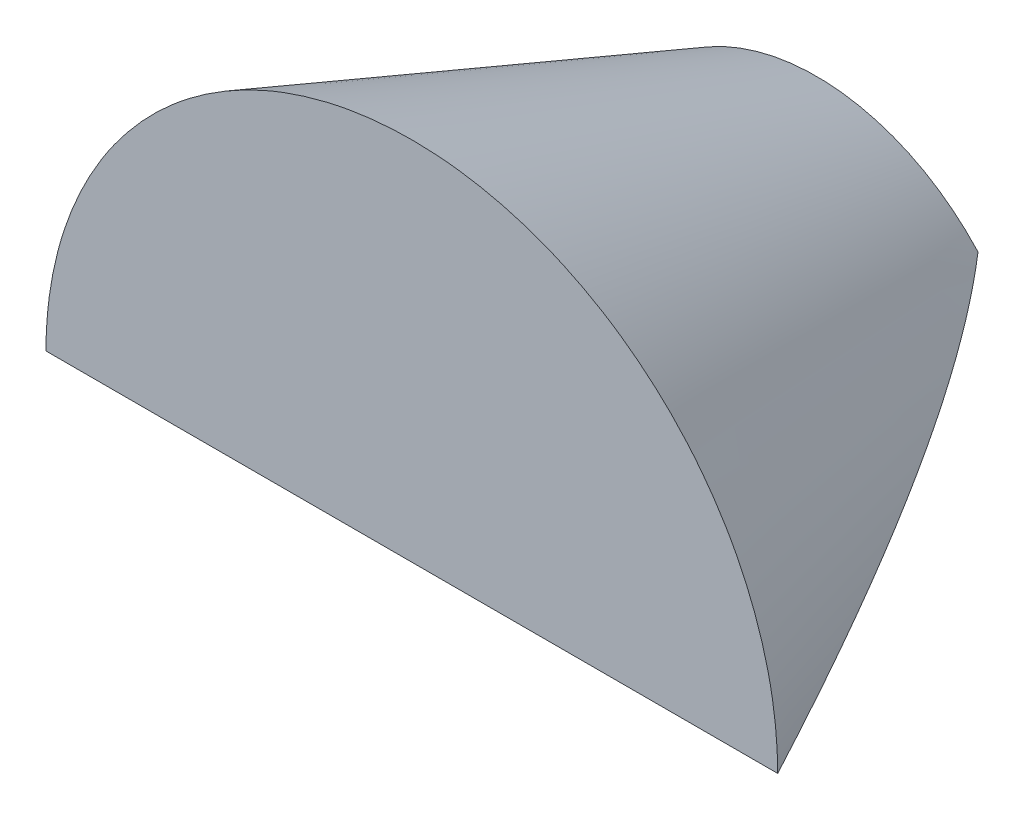
ISO-10303-21;
HEADER;
FILE_DESCRIPTION(('STEP AP214'),'2;1');
FILE_NAME('part.step','',(''),(''),'','','');
FILE_SCHEMA(('AUTOMOTIVE_DESIGN { 1 0 10303 214 1 1 1 1 }'));
ENDSEC;
DATA;
#1=APPLICATION_CONTEXT('core data for automotive mechanical design processes');
#2=APPLICATION_PROTOCOL_DEFINITION('international standard','automotive_design',2000,#1);
#3=PRODUCT_CONTEXT('',#1,'mechanical');
#4=PRODUCT('Part','Part','',(#3));
#5=PRODUCT_RELATED_PRODUCT_CATEGORY('part','',(#4));
#6=PRODUCT_DEFINITION_FORMATION('','',#4);
#7=PRODUCT_DEFINITION_CONTEXT('part definition',#1,'design');
#8=PRODUCT_DEFINITION('design','',#6,#7);
#9=PRODUCT_DEFINITION_SHAPE('','',#8);
#10=(LENGTH_UNIT() NAMED_UNIT(*) SI_UNIT(.MILLI.,.METRE.));
#11=(NAMED_UNIT(*) PLANE_ANGLE_UNIT() SI_UNIT($,.RADIAN.));
#12=(NAMED_UNIT(*) SI_UNIT($,.STERADIAN.) SOLID_ANGLE_UNIT());
#13=UNCERTAINTY_MEASURE_WITH_UNIT(LENGTH_MEASURE(1.E-05),#10,'distance_accuracy_value','');
#14=(GEOMETRIC_REPRESENTATION_CONTEXT(3) GLOBAL_UNCERTAINTY_ASSIGNED_CONTEXT((#13)) GLOBAL_UNIT_ASSIGNED_CONTEXT((#10,
#11,#12)) REPRESENTATION_CONTEXT('',''));
#15=CARTESIAN_POINT('',(0.,0.,0.));
#16=DIRECTION('',(0.,0.,1.));
#17=DIRECTION('',(1.,0.,0.));
#18=AXIS2_PLACEMENT_3D('',#15,#16,#17);
#19=CARTESIAN_POINT('',(0.,189.165525844627,0.));
#20=DIRECTION('',(0.,-0.939692620785908,-0.342020143325669));
#21=DIRECTION('',(0.,0.342020143325669,-0.939692620785908));
#22=AXIS2_PLACEMENT_3D('',#19,#20,#21);
#23=PLANE('',#22);
#24=DIRECTION('',(-1.,0.,0.));
#25=VECTOR('',#24,1.);
#26=CARTESIAN_POINT('',(0.,189.165525844627,0.));
#27=LINE('',#26,#25);
#28=CARTESIAN_POINT('',(143.075034277338,189.165525844627,0.));
#29=VERTEX_POINT('',#28);
#30=CARTESIAN_POINT('',(-1.61957825459202,189.165525844627,0.));
#31=VERTEX_POINT('',#30);
#32=EDGE_CURVE('E58',#29,#31,#27,.T.);
#33=ORIENTED_EDGE('',*,*,#32,.T.);
#34=CARTESIAN_POINT('',(38.7751042956745,218.283144585924,-80.));
#35=CARTESIAN_POINT('',(37.8429211587784,217.871249352963,-78.8683003516674));
#36=CARTESIAN_POINT('',(36.9358688823656,217.452819146367,-77.7186560333609));
#37=CARTESIAN_POINT('',(35.1210877565733,216.583099959861,-75.3291115150999));
#38=CARTESIAN_POINT('',(34.21573573982,216.131229192465,-74.0876140903145));
#39=CARTESIAN_POINT('',(32.873686204065,215.437503036114,-72.1816503745491));
#40=CARTESIAN_POINT('',(32.4210945944897,215.199212145389,-71.5269668096136));
#41=CARTESIAN_POINT('',(31.5687919467628,214.742669682188,-70.2726237402161));
#42=CARTESIAN_POINT('',(31.1680986777782,214.524631824679,-69.673554418033));
#43=CARTESIAN_POINT('',(29.95258588716,213.85334237402,-67.8291515298939));
#44=CARTESIAN_POINT('',(29.1516738237558,213.397140267019,-66.5757076796281));
#45=CARTESIAN_POINT('',(27.5483883986423,212.458369394705,-63.9965146264983));
#46=CARTESIAN_POINT('',(26.7474483854254,211.97551331596,-62.6699820071276));
#47=CARTESIAN_POINT('',(25.254747641762,211.051918542527,-60.1323188188058));
#48=CARTESIAN_POINT('',(24.5600167961568,210.611730359489,-58.9227308218835));
#49=CARTESIAN_POINT('',(23.1683427940379,209.710615409072,-56.446530586065));
#50=CARTESIAN_POINT('',(22.4722885921831,209.24952871994,-55.1794775190264));
#51=CARTESIAN_POINT('',(21.0781392374799,208.306507919397,-52.5883157186904));
#52=CARTESIAN_POINT('',(20.3808892849295,207.824425164063,-51.2638069643446));
#53=CARTESIAN_POINT('',(18.9845373419731,206.839400685187,-48.5576922164795));
#54=CARTESIAN_POINT('',(18.2862390767183,206.33632343253,-47.1757213519308));
#55=CARTESIAN_POINT('',(16.8879761909523,205.309378064097,-44.3546463788139));
#56=CARTESIAN_POINT('',(16.1887755685956,204.785388572319,-42.9152081598142));
#57=CARTESIAN_POINT('',(14.8918978431729,203.795389269862,-40.1952299966271));
#58=CARTESIAN_POINT('',(14.2918717090198,203.329724769877,-38.9156824087356));
#59=CARTESIAN_POINT('',(13.0894116985682,202.381962738342,-36.3114502879483));
#60=CARTESIAN_POINT('',(12.4874544252872,201.899794349904,-34.9865715864292));
#61=CARTESIAN_POINT('',(11.2813157742134,200.918976590715,-32.2916622598082));
#62=CARTESIAN_POINT('',(10.677591562269,200.420260251384,-30.9214515619327));
#63=CARTESIAN_POINT('',(9.46809465873548,199.406340168363,-28.1358649844255));
#64=CARTESIAN_POINT('',(8.86276049859574,198.891074039177,-26.7203215352593));
#65=CARTESIAN_POINT('',(7.65020703798981,197.844101877876,-23.8440557383923));
#66=CARTESIAN_POINT('',(7.04340831587017,197.312339024525,-22.3831768698418));
#67=CARTESIAN_POINT('',(5.90429259511191,196.300178111203,-19.6023035432239));
#68=CARTESIAN_POINT('',(5.37059011515785,195.819954985709,-18.2828123338185));
#69=CARTESIAN_POINT('',(4.30088901179907,194.845856183633,-15.6063289208767));
#70=CARTESIAN_POINT('',(3.76517663115286,194.35194365749,-14.2492357622441));
#71=CARTESIAN_POINT('',(2.69160500032191,193.350438243553,-11.4975412406092));
#72=CARTESIAN_POINT('',(2.15402240424656,192.842810041267,-10.1028448435681));
#73=CARTESIAN_POINT('',(1.07684647615022,191.813870476694,-7.27594039059461));
#74=CARTESIAN_POINT('',(0.537520399197297,191.292525761825,-5.84364269940259));
#75=CARTESIAN_POINT('',(-0.543002863691249,190.236182701768,-2.94152183715922));
#76=CARTESIAN_POINT('',(-1.0839416061438,189.701153531851,-1.4716136333357));
#77=CARTESIAN_POINT('',(-1.61957825459202,189.165525844627,0.));
#78=B_SPLINE_CURVE_WITH_KNOTS('',3,(#34,#35,#36,#37,#38,#39,#40,#41,#42,#43,#44,#45,#46,#47,#48,
#49,#50,#51,#52,#53,#54,#55,#56,#57,#58,#59,#60,#61,#62,#63,#64,#65,#66,#67,#68,#69,#70,#71,#72,
#73,#74,#75,#76,#77),.UNSPECIFIED.,.F.,.F.,(4,2,2,2,2,2,2,2,2,2,2,2,2,2,2,2,2,2,2,2,2,4),(0.,
4.5681356746335,9.37182304303466,11.8641540618551,14.1230266902609,18.7900414752348,
23.6587940689339,28.0466657305856,32.5986379159626,37.3160439911766,42.2000009759547,
47.251436824312,51.7153094149119,56.3142636355104,61.0487382239659,65.9190982182241,
70.9256425994494,75.4320990019067,80.0530632086017,84.7887052337872,89.6391635979123,
94.6045480754302),.UNSPECIFIED.);
#79=CARTESIAN_POINT('',(38.7751042956745,218.283144585924,-80.));
#80=VERTEX_POINT('',#79);
#81=EDGE_CURVE('E11',#80,#31,#78,.T.);
#82=ORIENTED_EDGE('',*,*,#81,.F.);
#83=DIRECTION('',(1.,0.,0.));
#84=VECTOR('',#83,1.);
#85=CARTESIAN_POINT('',(0.,218.283144585924,-80.));
#86=LINE('',#85,#84);
#87=CARTESIAN_POINT('',(102.680351727072,218.283144585924,-80.));
#88=VERTEX_POINT('',#87);
#89=EDGE_CURVE('E46',#88,#80,#86,.F.);
#90=ORIENTED_EDGE('',*,*,#89,.F.);
#91=CARTESIAN_POINT('',(102.680351727072,218.283144585924,-80.));
#92=CARTESIAN_POINT('',(122.877693002205,209.362867119761,-55.4917390864474));
#93=CARTESIAN_POINT('',(143.075034277338,189.165525844627,0.));
#94=B_SPLINE_CURVE_WITH_KNOTS('',2,(#91,#92,#93),.UNSPECIFIED.,.F.,.F.,(3,3),(0.,1.),.UNSPECIFIED.);
#95=EDGE_CURVE('E41',#88,#29,#94,.T.);
#96=ORIENTED_EDGE('',*,*,#95,.T.);
#97=EDGE_LOOP('',(#33,#82,#90,#96));
#98=FACE_BOUND('',#97,.T.);
#99=ADVANCED_FACE('F29',(#98),#23,.T.);
#100=CARTESIAN_POINT('',(70.7277280113731,189.165525844627,0.));
#101=DIRECTION('',(0.,0.,1.));
#102=DIRECTION('',(1.,0.,0.));
#103=AXIS2_PLACEMENT_3D('',#100,#101,#102);
#104=CONICAL_SURFACE('',#103,72.3473062659651,0.349065850398867);
#105=CARTESIAN_POINT('',(143.075034277338,189.165525844627,0.));
#106=CARTESIAN_POINT('',(143.075034277338,192.719470470487,0.));
#107=CARTESIAN_POINT('',(142.726662223137,196.256801915364,0.));
#108=CARTESIAN_POINT('',(142.378366075621,199.793362612135,0.));
#109=CARTESIAN_POINT('',(141.684901073856,203.279785121054,0.));
#110=CARTESIAN_POINT('',(140.991640885463,206.765177922711,0.));
#111=CARTESIAN_POINT('',(139.959783558847,210.166840294273,0.));
#112=CARTESIAN_POINT('',(138.928223783901,213.567521745028,0.));
#113=CARTESIAN_POINT('',(137.567923502824,216.851641328855,0.));
#114=CARTESIAN_POINT('',(136.208015490253,220.134813874223,0.));
#115=CARTESIAN_POINT('',(134.532355825651,223.269809936554,0.));
#116=CARTESIAN_POINT('',(132.857202878914,226.403857979102,0.));
#117=CARTESIAN_POINT('',(130.882314703469,229.35953564515,0.));
#118=CARTESIAN_POINT('',(128.908037649953,232.314298687543,0.));
#119=CARTESIAN_POINT('',(126.6529520276,235.062171067086,0.));
#120=CARTESIAN_POINT('',(124.398564233273,237.809193127535,0.));
#121=CARTESIAN_POINT('',(121.884998872617,240.322796705871,0.));
#122=CARTESIAN_POINT('',(119.37221132399,242.835622460352,0.));
#123=CARTESIAN_POINT('',(116.624373233832,245.090749860854,0.));
#124=CARTESIAN_POINT('',(113.877385448886,247.345179423084,0.));
#125=CARTESIAN_POINT('',(110.921737811896,249.320112536723,0.));
#126=CARTESIAN_POINT('',(107.967004786586,251.294434516318,0.));
#127=CARTESIAN_POINT('',(104.8320121033,252.970153658905,0.));
#128=CARTESIAN_POINT('',(101.697989529931,254.645354257457,0.));
#129=CARTESIAN_POINT('',(98.4138434956009,256.005721336078,0.));
#130=CARTESIAN_POINT('',(95.1307137239672,257.365667455856,0.));
#131=CARTESIAN_POINT('',(91.7290424610185,258.397581392101,0.));
#132=CARTESIAN_POINT('',(88.3284238276561,259.429176007913,0.));
#133=CARTESIAN_POINT('',(84.8419872877997,260.12269890711,0.));
#134=CARTESIAN_POINT('',(81.3566296086192,260.81600719905,0.));
#135=CARTESIAN_POINT('',(77.8190040821099,261.164460056391,0.));
#136=CARTESIAN_POINT('',(74.2824732564981,261.512805086702,0.));
#137=CARTESIAN_POINT('',(70.7277280113731,261.512832110592,0.));
#138=CARTESIAN_POINT('',(67.1740827635036,261.51285912612,0.));
#139=CARTESIAN_POINT('',(63.6364519406363,261.164460056391,0.));
#140=CARTESIAN_POINT('',(60.0999158181947,260.816168796841,0.));
#141=CARTESIAN_POINT('',(56.6134687349465,260.12269890711,0.));
#142=CARTESIAN_POINT('',(53.1281005150368,259.429443608114,0.));
#143=CARTESIAN_POINT('',(49.7264135617277,258.397581392101,0.));
#144=CARTESIAN_POINT('',(46.3257792435007,257.36603848071,0.));
#145=CARTESIAN_POINT('',(43.0416125271452,256.005721336078,0.));
#146=CARTESIAN_POINT('',(39.7584620800237,254.645825134894,0.));
#147=CARTESIAN_POINT('',(36.6234439194461,252.970153658905,0.));
#148=CARTESIAN_POINT('',(33.4893958768298,251.295000712287,0.));
#149=CARTESIAN_POINT('',(30.5337182108503,249.320112536723,0.));
#150=CARTESIAN_POINT('',(27.5789551667897,247.345835481929,0.));
#151=CARTESIAN_POINT('',(24.8310827889144,245.090749860854,0.));
#152=CARTESIAN_POINT('',(22.0840607278404,242.836362065925,0.));
#153=CARTESIAN_POINT('',(19.5704571501292,240.322796705871,0.));
#154=CARTESIAN_POINT('',(17.0576313961263,237.8100091577,0.));
#155=CARTESIAN_POINT('',(14.8025039951466,235.062171067086,0.));
#156=CARTESIAN_POINT('',(12.5480744338959,232.315183283461,0.));
#157=CARTESIAN_POINT('',(10.5731413192776,229.35953564515,0.));
#158=CARTESIAN_POINT('',(8.59881933962332,226.404802619897,0.));
#159=CARTESIAN_POINT('',(6.92310019709547,223.269809936554,0.));
#160=CARTESIAN_POINT('',(5.24789959863324,220.135787363185,0.));
#161=CARTESIAN_POINT('',(3.88753251992235,216.851641328855,0.));
#162=CARTESIAN_POINT('',(2.52758640055708,213.568511558435,0.));
#163=CARTESIAN_POINT('',(1.49567246389949,210.166840294273,0.));
#164=CARTESIAN_POINT('',(0.464077848277346,206.766221661684,0.));
#165=CARTESIAN_POINT('',(-0.229445051109889,203.279785121054,0.));
#166=CARTESIAN_POINT('',(-0.922753343014777,199.794427442231,0.));
#167=CARTESIAN_POINT('',(-1.27120620039112,196.256801915364,0.));
#168=CARTESIAN_POINT('',(-1.61957825459202,192.719996732971,0.));
#169=CARTESIAN_POINT('',(-1.61957825459202,189.165525844627,0.));
#170=B_SPLINE_CURVE_WITH_KNOTS('',2,(#105,#106,#107,#108,#109,#110,#111,#112,#113,#114,#115,
#116,#117,#118,#119,#120,#121,#122,#123,#124,#125,#126,#127,#128,#129,#130,#131,#132,#133,#134,
#135,#136,#137,#138,#139,#140,#141,#142,#143,#144,#145,#146,#147,#148,#149,#150,#151,#152,#153,
#154,#155,#156,#157,#158,#159,#160,#161,#162,#163,#164,#165,#166,#167,#168,#169),.UNSPECIFIED.,
.F.,.F.,(3,2,2,2,2,2,2,2,2,2,2,2,2,2,2,2,2,2,2,2,2,2,2,2,2,2,2,2,2,2,2,2,3),(0.,0.03125,0.0625,
0.09375,0.125,0.15625,0.1875,0.21875,0.25,0.28125,0.3125,0.34375,0.375,0.40625,0.4375,0.46875,
0.5,0.53125,0.5625,0.59375,0.625,0.65625,0.6875,0.71875,0.75,0.78125,0.8125,0.84375,0.875,
0.90625,0.9375,0.96875,1.),.UNSPECIFIED.);
#171=EDGE_CURVE('E69',#29,#31,#170,.T.);
#172=ORIENTED_EDGE('',*,*,#171,.F.);
#173=ORIENTED_EDGE('',*,*,#95,.F.);
#174=CARTESIAN_POINT('',(70.7277280113731,189.165525844627,-80.));
#175=DIRECTION('',(0.,0.,1.));
#176=DIRECTION('',(0.739136124855515,0.67355607705192,0.));
#177=AXIS2_PLACEMENT_3D('',#174,#175,#176);
#178=CIRCLE('',#177,43.2296875246688);
#179=EDGE_CURVE('E64',#88,#80,#178,.T.);
#180=ORIENTED_EDGE('',*,*,#179,.T.);
#181=ORIENTED_EDGE('',*,*,#81,.T.);
#182=EDGE_LOOP('',(#172,#173,#180,#181));
#183=FACE_BOUND('',#182,.T.);
#184=ADVANCED_FACE('F31',(#183),#104,.T.);
#185=CARTESIAN_POINT('',(0.,0.,-80.));
#186=DIRECTION('',(0.,0.,1.));
#187=DIRECTION('',(1.,0.,0.));
#188=AXIS2_PLACEMENT_3D('',#185,#186,#187);
#189=PLANE('',#188);
#190=ORIENTED_EDGE('',*,*,#89,.T.);
#191=ORIENTED_EDGE('',*,*,#179,.F.);
#192=EDGE_LOOP('',(#190,#191));
#193=FACE_BOUND('',#192,.T.);
#194=ADVANCED_FACE('F95',(#193),#189,.F.);
#195=CARTESIAN_POINT('',(0.,0.,0.));
#196=DIRECTION('',(0.,0.,1.));
#197=DIRECTION('',(1.,0.,0.));
#198=AXIS2_PLACEMENT_3D('',#195,#196,#197);
#199=PLANE('',#198);
#200=ORIENTED_EDGE('',*,*,#32,.F.);
#201=ORIENTED_EDGE('',*,*,#171,.T.);
#202=EDGE_LOOP('',(#200,#201));
#203=FACE_BOUND('',#202,.T.);
#204=ADVANCED_FACE('F68',(#203),#199,.T.);
#205=CLOSED_SHELL('',(#99,#184,#194,#204));
#206=MANIFOLD_SOLID_BREP('B2',#205);
#207=ADVANCED_BREP_SHAPE_REPRESENTATION('',(#18,#206),#14);
#208=SHAPE_DEFINITION_REPRESENTATION(#9,#207);
ENDSEC;
END-ISO-10303-21;
